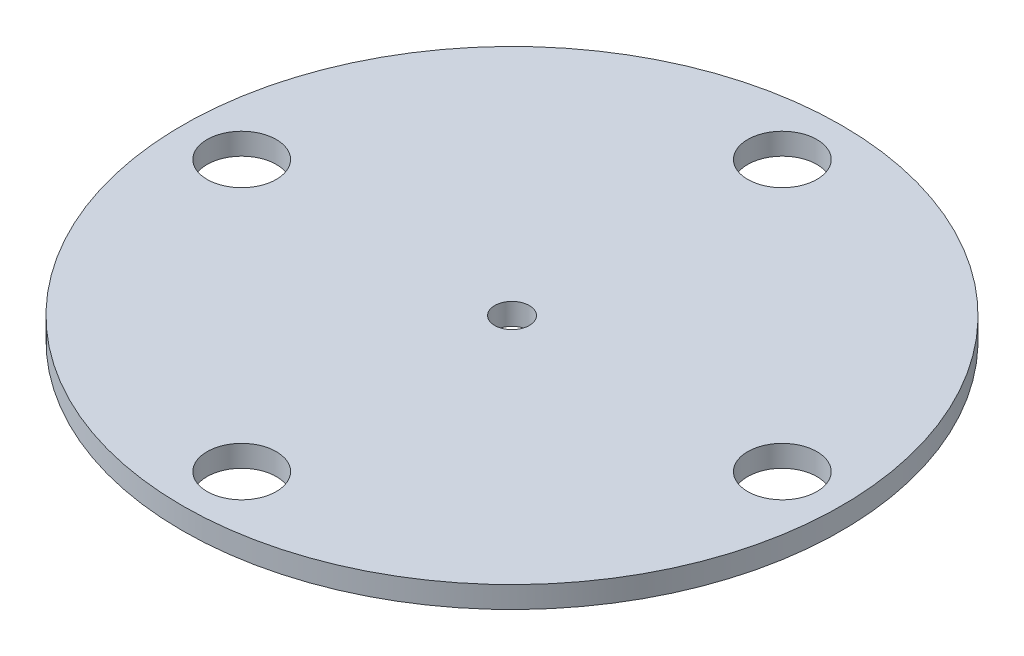
ISO-10303-21;
HEADER;
FILE_DESCRIPTION(('STEP AP214'),'2;1');
FILE_NAME('part.step','',(''),(''),'','','');
FILE_SCHEMA(('AUTOMOTIVE_DESIGN { 1 0 10303 214 1 1 1 1 }'));
ENDSEC;
DATA;
#1=APPLICATION_CONTEXT('core data for automotive mechanical design processes');
#2=APPLICATION_PROTOCOL_DEFINITION('international standard','automotive_design',2000,#1);
#3=PRODUCT_CONTEXT('',#1,'mechanical');
#4=PRODUCT('Part','Part','',(#3));
#5=PRODUCT_RELATED_PRODUCT_CATEGORY('part','',(#4));
#6=PRODUCT_DEFINITION_FORMATION('','',#4);
#7=PRODUCT_DEFINITION_CONTEXT('part definition',#1,'design');
#8=PRODUCT_DEFINITION('design','',#6,#7);
#9=PRODUCT_DEFINITION_SHAPE('','',#8);
#10=(LENGTH_UNIT() NAMED_UNIT(*) SI_UNIT(.MILLI.,.METRE.));
#11=(NAMED_UNIT(*) PLANE_ANGLE_UNIT() SI_UNIT($,.RADIAN.));
#12=(NAMED_UNIT(*) SI_UNIT($,.STERADIAN.) SOLID_ANGLE_UNIT());
#13=UNCERTAINTY_MEASURE_WITH_UNIT(LENGTH_MEASURE(1.E-05),#10,'distance_accuracy_value','');
#14=(GEOMETRIC_REPRESENTATION_CONTEXT(3) GLOBAL_UNCERTAINTY_ASSIGNED_CONTEXT((#13)) GLOBAL_UNIT_ASSIGNED_CONTEXT((#10,
#11,#12)) REPRESENTATION_CONTEXT('',''));
#15=CARTESIAN_POINT('',(0.,0.,0.));
#16=DIRECTION('',(0.,0.,1.));
#17=DIRECTION('',(1.,0.,0.));
#18=AXIS2_PLACEMENT_3D('',#15,#16,#17);
#19=CARTESIAN_POINT('',(0.,5.,0.));
#20=DIRECTION('',(0.,-1.,0.));
#21=DIRECTION('',(0.,0.,-1.));
#22=AXIS2_PLACEMENT_3D('',#19,#20,#21);
#23=CYLINDRICAL_SURFACE('',#22,4.);
#24=CARTESIAN_POINT('',(0.,5.,0.));
#25=DIRECTION('',(0.,1.,0.));
#26=DIRECTION('',(0.,0.,1.));
#27=AXIS2_PLACEMENT_3D('',#24,#25,#26);
#28=CIRCLE('',#27,4.);
#29=CARTESIAN_POINT('',(0.,5.,4.));
#30=VERTEX_POINT('',#29);
#31=EDGE_CURVE('E40',#30,#30,#28,.T.);
#32=ORIENTED_EDGE('',*,*,#31,.T.);
#33=EDGE_LOOP('',(#32));
#34=FACE_BOUND('',#33,.T.);
#35=CARTESIAN_POINT('',(0.,0.,0.));
#36=DIRECTION('',(0.,1.,0.));
#37=DIRECTION('',(0.,0.,1.));
#38=AXIS2_PLACEMENT_3D('',#35,#36,#37);
#39=CIRCLE('',#38,4.);
#40=CARTESIAN_POINT('',(0.,0.,4.));
#41=VERTEX_POINT('',#40);
#42=EDGE_CURVE('E47',#41,#41,#39,.T.);
#43=ORIENTED_EDGE('',*,*,#42,.F.);
#44=EDGE_LOOP('',(#43));
#45=FACE_BOUND('',#44,.T.);
#46=ADVANCED_FACE('F33',(#34,#45),#23,.F.);
#47=CARTESIAN_POINT('',(0.,5.,0.));
#48=DIRECTION('',(0.,-1.,0.));
#49=DIRECTION('',(0.,0.,-1.));
#50=AXIS2_PLACEMENT_3D('',#47,#48,#49);
#51=CYLINDRICAL_SURFACE('',#50,76.2);
#52=CARTESIAN_POINT('',(0.,5.,0.));
#53=DIRECTION('',(0.,1.,0.));
#54=DIRECTION('',(0.,0.,1.));
#55=AXIS2_PLACEMENT_3D('',#52,#53,#54);
#56=CIRCLE('',#55,76.2);
#57=CARTESIAN_POINT('',(0.,5.,76.2));
#58=VERTEX_POINT('',#57);
#59=EDGE_CURVE('E10',#58,#58,#56,.T.);
#60=ORIENTED_EDGE('',*,*,#59,.F.);
#61=EDGE_LOOP('',(#60));
#62=FACE_BOUND('',#61,.T.);
#63=CARTESIAN_POINT('',(0.,0.,0.));
#64=DIRECTION('',(0.,1.,0.));
#65=DIRECTION('',(0.,0.,1.));
#66=AXIS2_PLACEMENT_3D('',#63,#64,#65);
#67=CIRCLE('',#66,76.2);
#68=CARTESIAN_POINT('',(0.,0.,76.2));
#69=VERTEX_POINT('',#68);
#70=EDGE_CURVE('E36',#69,#69,#67,.T.);
#71=ORIENTED_EDGE('',*,*,#70,.T.);
#72=EDGE_LOOP('',(#71));
#73=FACE_BOUND('',#72,.T.);
#74=ADVANCED_FACE('F85',(#62,#73),#51,.T.);
#75=CARTESIAN_POINT('',(0.,5.,0.));
#76=DIRECTION('',(0.,1.,0.));
#77=DIRECTION('',(0.,0.,1.));
#78=AXIS2_PLACEMENT_3D('',#75,#76,#77);
#79=PLANE('',#78);
#80=CARTESIAN_POINT('',(0.,5.,62.5));
#81=DIRECTION('',(0.,1.,0.));
#82=DIRECTION('',(0.,0.,1.));
#83=AXIS2_PLACEMENT_3D('',#80,#81,#82);
#84=CIRCLE('',#83,8.);
#85=CARTESIAN_POINT('',(0.,5.,70.5));
#86=VERTEX_POINT('',#85);
#87=EDGE_CURVE('E54',#86,#86,#84,.T.);
#88=ORIENTED_EDGE('',*,*,#87,.F.);
#89=EDGE_LOOP('',(#88));
#90=FACE_BOUND('',#89,.T.);
#91=CARTESIAN_POINT('',(-62.5,5.,0.));
#92=DIRECTION('',(0.,1.,0.));
#93=DIRECTION('',(0.,0.,1.));
#94=AXIS2_PLACEMENT_3D('',#91,#92,#93);
#95=CIRCLE('',#94,8.);
#96=CARTESIAN_POINT('',(-62.5,5.,7.99999999999999));
#97=VERTEX_POINT('',#96);
#98=EDGE_CURVE('E64',#97,#97,#95,.T.);
#99=ORIENTED_EDGE('',*,*,#98,.F.);
#100=EDGE_LOOP('',(#99));
#101=FACE_BOUND('',#100,.T.);
#102=CARTESIAN_POINT('',(0.,5.,-62.5));
#103=DIRECTION('',(0.,1.,0.));
#104=DIRECTION('',(0.,0.,1.));
#105=AXIS2_PLACEMENT_3D('',#102,#103,#104);
#106=CIRCLE('',#105,8.);
#107=CARTESIAN_POINT('',(0.,5.,-54.5));
#108=VERTEX_POINT('',#107);
#109=EDGE_CURVE('E70',#108,#108,#106,.T.);
#110=ORIENTED_EDGE('',*,*,#109,.F.);
#111=EDGE_LOOP('',(#110));
#112=FACE_BOUND('',#111,.T.);
#113=CARTESIAN_POINT('',(62.5,5.,0.));
#114=DIRECTION('',(0.,1.,0.));
#115=DIRECTION('',(0.,0.,1.));
#116=AXIS2_PLACEMENT_3D('',#113,#114,#115);
#117=CIRCLE('',#116,8.);
#118=CARTESIAN_POINT('',(62.5,5.,7.99999999999999));
#119=VERTEX_POINT('',#118);
#120=EDGE_CURVE('E75',#119,#119,#117,.T.);
#121=ORIENTED_EDGE('',*,*,#120,.F.);
#122=EDGE_LOOP('',(#121));
#123=FACE_BOUND('',#122,.T.);
#124=ORIENTED_EDGE('',*,*,#31,.F.);
#125=EDGE_LOOP('',(#124));
#126=FACE_BOUND('',#125,.T.);
#127=ORIENTED_EDGE('',*,*,#59,.T.);
#128=EDGE_LOOP('',(#127));
#129=FACE_BOUND('',#128,.T.);
#130=ADVANCED_FACE('F81',(#90,#101,#112,#123,#126,#129),#79,.T.);
#131=CARTESIAN_POINT('',(0.,0.,0.));
#132=DIRECTION('',(0.,1.,0.));
#133=DIRECTION('',(0.,0.,1.));
#134=AXIS2_PLACEMENT_3D('',#131,#132,#133);
#135=PLANE('',#134);
#136=CARTESIAN_POINT('',(0.,0.,62.5));
#137=DIRECTION('',(0.,1.,0.));
#138=DIRECTION('',(0.,0.,1.));
#139=AXIS2_PLACEMENT_3D('',#136,#137,#138);
#140=CIRCLE('',#139,8.);
#141=CARTESIAN_POINT('',(0.,0.,70.5));
#142=VERTEX_POINT('',#141);
#143=EDGE_CURVE('E49',#142,#142,#140,.T.);
#144=ORIENTED_EDGE('',*,*,#143,.T.);
#145=EDGE_LOOP('',(#144));
#146=FACE_BOUND('',#145,.T.);
#147=CARTESIAN_POINT('',(-62.5,0.,0.));
#148=DIRECTION('',(0.,1.,0.));
#149=DIRECTION('',(0.,0.,1.));
#150=AXIS2_PLACEMENT_3D('',#147,#148,#149);
#151=CIRCLE('',#150,8.);
#152=CARTESIAN_POINT('',(-62.5,0.,7.99999999999999));
#153=VERTEX_POINT('',#152);
#154=EDGE_CURVE('E59',#153,#153,#151,.T.);
#155=ORIENTED_EDGE('',*,*,#154,.T.);
#156=EDGE_LOOP('',(#155));
#157=FACE_BOUND('',#156,.T.);
#158=CARTESIAN_POINT('',(0.,0.,-62.5));
#159=DIRECTION('',(0.,1.,0.));
#160=DIRECTION('',(0.,0.,1.));
#161=AXIS2_PLACEMENT_3D('',#158,#159,#160);
#162=CIRCLE('',#161,8.);
#163=CARTESIAN_POINT('',(0.,0.,-54.5));
#164=VERTEX_POINT('',#163);
#165=EDGE_CURVE('E67',#164,#164,#162,.T.);
#166=ORIENTED_EDGE('',*,*,#165,.T.);
#167=EDGE_LOOP('',(#166));
#168=FACE_BOUND('',#167,.T.);
#169=CARTESIAN_POINT('',(62.5,0.,0.));
#170=DIRECTION('',(0.,1.,0.));
#171=DIRECTION('',(0.,0.,1.));
#172=AXIS2_PLACEMENT_3D('',#169,#170,#171);
#173=CIRCLE('',#172,8.);
#174=CARTESIAN_POINT('',(62.5,0.,7.99999999999999));
#175=VERTEX_POINT('',#174);
#176=EDGE_CURVE('E73',#175,#175,#173,.T.);
#177=ORIENTED_EDGE('',*,*,#176,.T.);
#178=EDGE_LOOP('',(#177));
#179=FACE_BOUND('',#178,.T.);
#180=ORIENTED_EDGE('',*,*,#42,.T.);
#181=EDGE_LOOP('',(#180));
#182=FACE_BOUND('',#181,.T.);
#183=ORIENTED_EDGE('',*,*,#70,.F.);
#184=EDGE_LOOP('',(#183));
#185=FACE_BOUND('',#184,.T.);
#186=ADVANCED_FACE('F84',(#146,#157,#168,#179,#182,#185),#135,.F.);
#187=CARTESIAN_POINT('',(62.5,0.,0.));
#188=DIRECTION('',(0.,1.,0.));
#189=DIRECTION('',(0.,0.,1.));
#190=AXIS2_PLACEMENT_3D('',#187,#188,#189);
#191=CYLINDRICAL_SURFACE('',#190,8.);
#192=ORIENTED_EDGE('',*,*,#176,.F.);
#193=EDGE_LOOP('',(#192));
#194=FACE_BOUND('',#193,.T.);
#195=ORIENTED_EDGE('',*,*,#120,.T.);
#196=EDGE_LOOP('',(#195));
#197=FACE_BOUND('',#196,.T.);
#198=ADVANCED_FACE('F79',(#194,#197),#191,.F.);
#199=CARTESIAN_POINT('',(0.,0.,-62.5));
#200=DIRECTION('',(0.,1.,0.));
#201=DIRECTION('',(0.,0.,1.));
#202=AXIS2_PLACEMENT_3D('',#199,#200,#201);
#203=CYLINDRICAL_SURFACE('',#202,8.);
#204=ORIENTED_EDGE('',*,*,#165,.F.);
#205=EDGE_LOOP('',(#204));
#206=FACE_BOUND('',#205,.T.);
#207=ORIENTED_EDGE('',*,*,#109,.T.);
#208=EDGE_LOOP('',(#207));
#209=FACE_BOUND('',#208,.T.);
#210=ADVANCED_FACE('F104',(#206,#209),#203,.F.);
#211=CARTESIAN_POINT('',(-62.5,0.,0.));
#212=DIRECTION('',(0.,1.,0.));
#213=DIRECTION('',(0.,0.,1.));
#214=AXIS2_PLACEMENT_3D('',#211,#212,#213);
#215=CYLINDRICAL_SURFACE('',#214,8.);
#216=ORIENTED_EDGE('',*,*,#154,.F.);
#217=EDGE_LOOP('',(#216));
#218=FACE_BOUND('',#217,.T.);
#219=ORIENTED_EDGE('',*,*,#98,.T.);
#220=EDGE_LOOP('',(#219));
#221=FACE_BOUND('',#220,.T.);
#222=ADVANCED_FACE('F108',(#218,#221),#215,.F.);
#223=CARTESIAN_POINT('',(0.,0.,62.5));
#224=DIRECTION('',(0.,1.,0.));
#225=DIRECTION('',(0.,0.,1.));
#226=AXIS2_PLACEMENT_3D('',#223,#224,#225);
#227=CYLINDRICAL_SURFACE('',#226,8.);
#228=ORIENTED_EDGE('',*,*,#143,.F.);
#229=EDGE_LOOP('',(#228));
#230=FACE_BOUND('',#229,.T.);
#231=ORIENTED_EDGE('',*,*,#87,.T.);
#232=EDGE_LOOP('',(#231));
#233=FACE_BOUND('',#232,.T.);
#234=ADVANCED_FACE('F112',(#230,#233),#227,.F.);
#235=CLOSED_SHELL('',(#46,#74,#130,#186,#198,#210,#222,#234));
#236=MANIFOLD_SOLID_BREP('B2',#235);
#237=ADVANCED_BREP_SHAPE_REPRESENTATION('',(#18,#236),#14);
#238=SHAPE_DEFINITION_REPRESENTATION(#9,#237);
ENDSEC;
END-ISO-10303-21;
